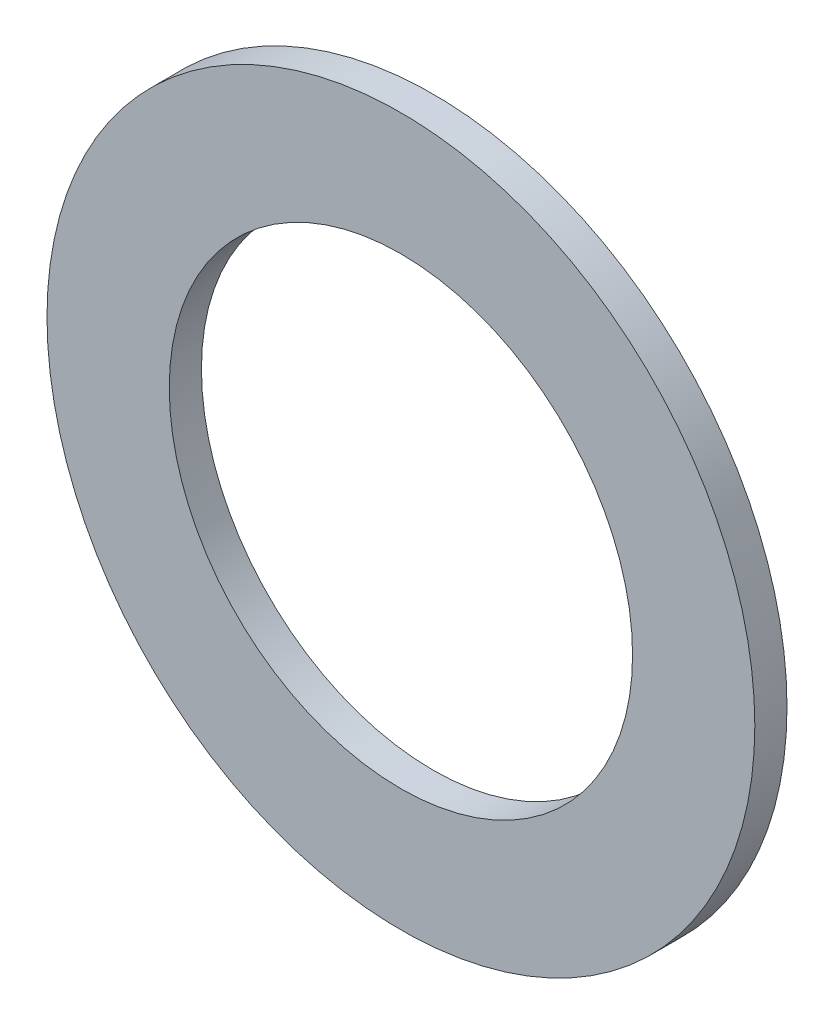
ISO-10303-21;
HEADER;
FILE_DESCRIPTION(('STEP AP214'),'2;1');
FILE_NAME('part.step','',(''),(''),'','','');
FILE_SCHEMA(('AUTOMOTIVE_DESIGN { 1 0 10303 214 1 1 1 1 }'));
ENDSEC;
DATA;
#1=APPLICATION_CONTEXT('core data for automotive mechanical design processes');
#2=APPLICATION_PROTOCOL_DEFINITION('international standard','automotive_design',2000,#1);
#3=PRODUCT_CONTEXT('',#1,'mechanical');
#4=PRODUCT('Part','Part','',(#3));
#5=PRODUCT_RELATED_PRODUCT_CATEGORY('part','',(#4));
#6=PRODUCT_DEFINITION_FORMATION('','',#4);
#7=PRODUCT_DEFINITION_CONTEXT('part definition',#1,'design');
#8=PRODUCT_DEFINITION('design','',#6,#7);
#9=PRODUCT_DEFINITION_SHAPE('','',#8);
#10=(LENGTH_UNIT() NAMED_UNIT(*) SI_UNIT(.MILLI.,.METRE.));
#11=(NAMED_UNIT(*) PLANE_ANGLE_UNIT() SI_UNIT($,.RADIAN.));
#12=(NAMED_UNIT(*) SI_UNIT($,.STERADIAN.) SOLID_ANGLE_UNIT());
#13=UNCERTAINTY_MEASURE_WITH_UNIT(LENGTH_MEASURE(1.E-05),#10,'distance_accuracy_value','');
#14=(GEOMETRIC_REPRESENTATION_CONTEXT(3) GLOBAL_UNCERTAINTY_ASSIGNED_CONTEXT((#13)) GLOBAL_UNIT_ASSIGNED_CONTEXT((#10,
#11,#12)) REPRESENTATION_CONTEXT('',''));
#15=CARTESIAN_POINT('',(0.,0.,0.));
#16=DIRECTION('',(0.,0.,1.));
#17=DIRECTION('',(1.,0.,0.));
#18=AXIS2_PLACEMENT_3D('',#15,#16,#17);
#19=CARTESIAN_POINT('',(0.,0.,0.5));
#20=DIRECTION('',(0.,0.,-1.));
#21=DIRECTION('',(-1.,0.,0.));
#22=AXIS2_PLACEMENT_3D('',#19,#20,#21);
#23=CYLINDRICAL_SURFACE('',#22,5.5);
#24=CARTESIAN_POINT('',(0.,0.,0.5));
#25=DIRECTION('',(0.,0.,1.));
#26=DIRECTION('',(1.,0.,0.));
#27=AXIS2_PLACEMENT_3D('',#24,#25,#26);
#28=CIRCLE('',#27,5.5);
#29=CARTESIAN_POINT('',(5.5,0.,0.5));
#30=VERTEX_POINT('',#29);
#31=EDGE_CURVE('E10',#30,#30,#28,.T.);
#32=ORIENTED_EDGE('',*,*,#31,.F.);
#33=EDGE_LOOP('',(#32));
#34=FACE_BOUND('',#33,.T.);
#35=CARTESIAN_POINT('',(0.,0.,0.));
#36=DIRECTION('',(0.,0.,1.));
#37=DIRECTION('',(1.,0.,0.));
#38=AXIS2_PLACEMENT_3D('',#35,#36,#37);
#39=CIRCLE('',#38,5.5);
#40=CARTESIAN_POINT('',(5.5,0.,0.));
#41=VERTEX_POINT('',#40);
#42=EDGE_CURVE('E48',#41,#41,#39,.T.);
#43=ORIENTED_EDGE('',*,*,#42,.T.);
#44=EDGE_LOOP('',(#43));
#45=FACE_BOUND('',#44,.T.);
#46=ADVANCED_FACE('F41',(#34,#45),#23,.T.);
#47=CARTESIAN_POINT('',(0.,0.,0.5));
#48=DIRECTION('',(0.,0.,1.));
#49=DIRECTION('',(1.,0.,0.));
#50=AXIS2_PLACEMENT_3D('',#47,#48,#49);
#51=PLANE('',#50);
#52=CARTESIAN_POINT('',(0.,0.,0.5));
#53=DIRECTION('',(0.,0.,1.));
#54=DIRECTION('',(1.,0.,0.));
#55=AXIS2_PLACEMENT_3D('',#52,#53,#54);
#56=CIRCLE('',#55,3.6);
#57=CARTESIAN_POINT('',(3.6,0.,0.5));
#58=VERTEX_POINT('',#57);
#59=EDGE_CURVE('E53',#58,#58,#56,.F.);
#60=ORIENTED_EDGE('',*,*,#59,.T.);
#61=EDGE_LOOP('',(#60));
#62=FACE_BOUND('',#61,.T.);
#63=ORIENTED_EDGE('',*,*,#31,.T.);
#64=EDGE_LOOP('',(#63));
#65=FACE_BOUND('',#64,.T.);
#66=ADVANCED_FACE('F66',(#62,#65),#51,.T.);
#67=CARTESIAN_POINT('',(0.,0.,0.));
#68=DIRECTION('',(0.,0.,1.));
#69=DIRECTION('',(1.,0.,0.));
#70=AXIS2_PLACEMENT_3D('',#67,#68,#69);
#71=PLANE('',#70);
#72=CARTESIAN_POINT('',(0.,0.,0.));
#73=DIRECTION('',(0.,0.,1.));
#74=DIRECTION('',(1.,0.,0.));
#75=AXIS2_PLACEMENT_3D('',#72,#73,#74);
#76=CIRCLE('',#75,3.6);
#77=CARTESIAN_POINT('',(3.6,0.,0.));
#78=VERTEX_POINT('',#77);
#79=EDGE_CURVE('E44',#78,#78,#76,.F.);
#80=ORIENTED_EDGE('',*,*,#79,.F.);
#81=EDGE_LOOP('',(#80));
#82=FACE_BOUND('',#81,.T.);
#83=ORIENTED_EDGE('',*,*,#42,.F.);
#84=EDGE_LOOP('',(#83));
#85=FACE_BOUND('',#84,.T.);
#86=ADVANCED_FACE('F63',(#82,#85),#71,.F.);
#87=CARTESIAN_POINT('',(0.,0.,1.));
#88=DIRECTION('',(0.,0.,-1.));
#89=DIRECTION('',(-1.,0.,0.));
#90=AXIS2_PLACEMENT_3D('',#87,#88,#89);
#91=CYLINDRICAL_SURFACE('',#90,3.6);
#92=ORIENTED_EDGE('',*,*,#59,.F.);
#93=EDGE_LOOP('',(#92));
#94=FACE_BOUND('',#93,.T.);
#95=ORIENTED_EDGE('',*,*,#79,.T.);
#96=EDGE_LOOP('',(#95));
#97=FACE_BOUND('',#96,.T.);
#98=ADVANCED_FACE('F61',(#94,#97),#91,.F.);
#99=CLOSED_SHELL('',(#46,#66,#86,#98));
#100=MANIFOLD_SOLID_BREP('B2',#99);
#101=ADVANCED_BREP_SHAPE_REPRESENTATION('',(#18,#100),#14);
#102=SHAPE_DEFINITION_REPRESENTATION(#9,#101);
ENDSEC;
END-ISO-10303-21;
